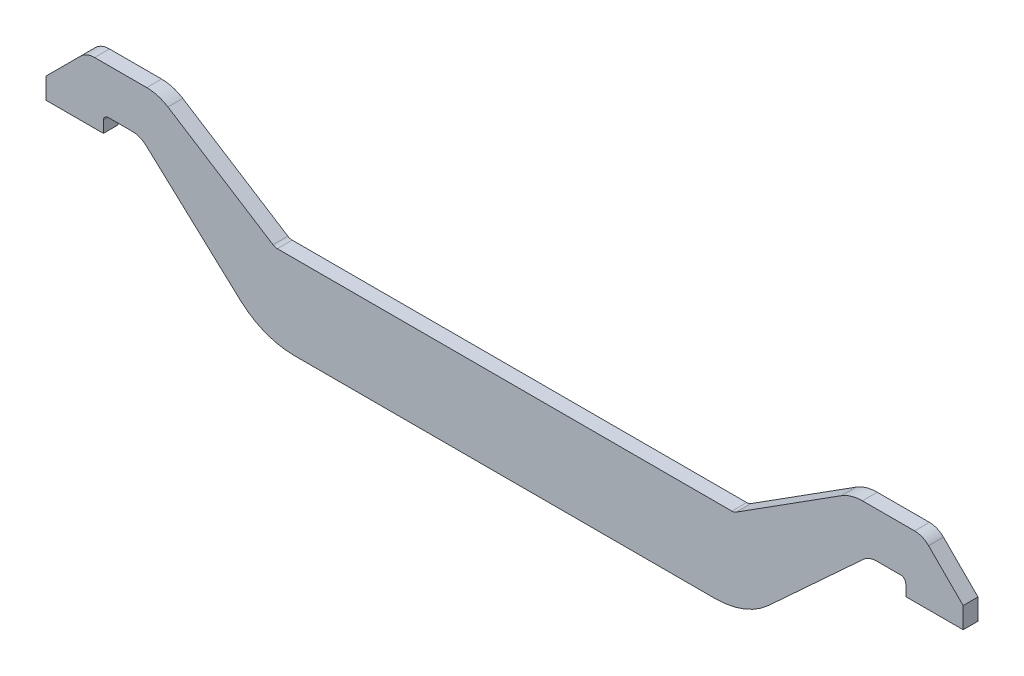
ISO-10303-21;
HEADER;
FILE_DESCRIPTION(('STEP AP214'),'2;1');
FILE_NAME('part.step','',(''),(''),'','','');
FILE_SCHEMA(('AUTOMOTIVE_DESIGN { 1 0 10303 214 1 1 1 1 }'));
ENDSEC;
DATA;
#1=APPLICATION_CONTEXT('core data for automotive mechanical design processes');
#2=APPLICATION_PROTOCOL_DEFINITION('international standard','automotive_design',2000,#1);
#3=PRODUCT_CONTEXT('',#1,'mechanical');
#4=PRODUCT('Part','Part','',(#3));
#5=PRODUCT_RELATED_PRODUCT_CATEGORY('part','',(#4));
#6=PRODUCT_DEFINITION_FORMATION('','',#4);
#7=PRODUCT_DEFINITION_CONTEXT('part definition',#1,'design');
#8=PRODUCT_DEFINITION('design','',#6,#7);
#9=PRODUCT_DEFINITION_SHAPE('','',#8);
#10=(LENGTH_UNIT() NAMED_UNIT(*) SI_UNIT(.MILLI.,.METRE.));
#11=(NAMED_UNIT(*) PLANE_ANGLE_UNIT() SI_UNIT($,.RADIAN.));
#12=(NAMED_UNIT(*) SI_UNIT($,.STERADIAN.) SOLID_ANGLE_UNIT());
#13=UNCERTAINTY_MEASURE_WITH_UNIT(LENGTH_MEASURE(1.E-05),#10,'distance_accuracy_value','');
#14=(GEOMETRIC_REPRESENTATION_CONTEXT(3) GLOBAL_UNCERTAINTY_ASSIGNED_CONTEXT((#13)) GLOBAL_UNIT_ASSIGNED_CONTEXT((#10,
#11,#12)) REPRESENTATION_CONTEXT('',''));
#15=CARTESIAN_POINT('',(0.,0.,0.));
#16=DIRECTION('',(0.,0.,1.));
#17=DIRECTION('',(1.,0.,0.));
#18=AXIS2_PLACEMENT_3D('',#15,#16,#17);
#19=CARTESIAN_POINT('',(31.2684472351527,-49.1956903166402,4.7625));
#20=DIRECTION('',(-0.536412624057495,0.84395586185046,0.));
#21=DIRECTION('',(-0.84395586185046,-0.536412624057495,0.));
#22=AXIS2_PLACEMENT_3D('',#19,#20,#21);
#23=PLANE('',#22);
#24=DIRECTION('',(0.84395586185046,0.536412624057495,0.));
#25=VECTOR('',#24,1.);
#26=CARTESIAN_POINT('',(31.2684472351527,-49.1956903166402,4.7625));
#27=LINE('',#26,#25);
#28=CARTESIAN_POINT('',(151.753593987816,27.3838521108998,4.7625));
#29=VERTEX_POINT('',#28);
#30=CARTESIAN_POINT('',(185.477030060921,48.8182394455008,4.7625));
#31=VERTEX_POINT('',#30);
#32=EDGE_CURVE('E343',#29,#31,#27,.T.);
#33=ORIENTED_EDGE('',*,*,#32,.T.);
#34=DIRECTION('',(0.,0.,-1.));
#35=VECTOR('',#34,1.);
#36=CARTESIAN_POINT('',(185.477030060921,48.8182394455008,0.));
#37=LINE('',#36,#35);
#38=CARTESIAN_POINT('',(185.477030060921,48.8182394455008,0.));
#39=VERTEX_POINT('',#38);
#40=EDGE_CURVE('E425',#31,#39,#37,.T.);
#41=ORIENTED_EDGE('',*,*,#40,.T.);
#42=DIRECTION('',(0.84395586185046,0.536412624057495,0.));
#43=VECTOR('',#42,1.);
#44=CARTESIAN_POINT('',(31.2684472351527,-49.1956903166402,0.));
#45=LINE('',#44,#43);
#46=CARTESIAN_POINT('',(151.753593987816,27.3838521108998,0.));
#47=VERTEX_POINT('',#46);
#48=EDGE_CURVE('E296',#47,#39,#45,.T.);
#49=ORIENTED_EDGE('',*,*,#48,.F.);
#50=DIRECTION('',(0.,0.,-1.));
#51=VECTOR('',#50,1.);
#52=CARTESIAN_POINT('',(151.753593987816,27.3838521108998,4.7625));
#53=LINE('',#52,#51);
#54=EDGE_CURVE('E375',#47,#29,#53,.F.);
#55=ORIENTED_EDGE('',*,*,#54,.T.);
#56=EDGE_LOOP('',(#33,#41,#49,#55));
#57=FACE_BOUND('',#56,.T.);
#58=ADVANCED_FACE('F34',(#57),#23,.T.);
#59=CARTESIAN_POINT('',(0.,26.9875,4.7625));
#60=DIRECTION('',(0.,1.,0.));
#61=DIRECTION('',(0.,0.,1.));
#62=AXIS2_PLACEMENT_3D('',#59,#60,#61);
#63=PLANE('',#62);
#64=DIRECTION('',(1.,0.,0.));
#65=VECTOR('',#64,1.);
#66=CARTESIAN_POINT('',(0.,26.9875,4.7625));
#67=LINE('',#66,#65);
#68=CARTESIAN_POINT('',(4.5488940772903,26.9875,4.7625));
#69=VERTEX_POINT('',#68);
#70=CARTESIAN_POINT('',(150.39110592271,26.9875,4.7625));
#71=VERTEX_POINT('',#70);
#72=EDGE_CURVE('E818',#69,#71,#67,.T.);
#73=ORIENTED_EDGE('',*,*,#72,.T.);
#74=DIRECTION('',(0.,0.,-1.));
#75=VECTOR('',#74,1.);
#76=CARTESIAN_POINT('',(150.39110592271,26.9875,0.));
#77=LINE('',#76,#75);
#78=CARTESIAN_POINT('',(150.39110592271,26.9875,0.));
#79=VERTEX_POINT('',#78);
#80=EDGE_CURVE('E372',#71,#79,#77,.T.);
#81=ORIENTED_EDGE('',*,*,#80,.T.);
#82=DIRECTION('',(1.,0.,0.));
#83=VECTOR('',#82,1.);
#84=CARTESIAN_POINT('',(0.,26.9875,0.));
#85=LINE('',#84,#83);
#86=CARTESIAN_POINT('',(4.5488940772903,26.9875,0.));
#87=VERTEX_POINT('',#86);
#88=EDGE_CURVE('E299',#87,#79,#85,.T.);
#89=ORIENTED_EDGE('',*,*,#88,.F.);
#90=DIRECTION('',(0.,0.,-1.));
#91=VECTOR('',#90,1.);
#92=CARTESIAN_POINT('',(4.5488940772903,26.9875,4.7625));
#93=LINE('',#92,#91);
#94=EDGE_CURVE('E370',#87,#69,#93,.F.);
#95=ORIENTED_EDGE('',*,*,#94,.T.);
#96=EDGE_LOOP('',(#73,#81,#89,#95));
#97=FACE_BOUND('',#96,.T.);
#98=ADVANCED_FACE('F523',(#97),#63,.T.);
#99=CARTESIAN_POINT('',(13.3137564581308,20.9469768274592,4.7625));
#100=DIRECTION('',(-0.536412624057495,-0.84395586185046,0.));
#101=DIRECTION('',(0.84395586185046,-0.536412624057495,0.));
#102=AXIS2_PLACEMENT_3D('',#99,#100,#101);
#103=PLANE('',#102);
#104=DIRECTION('',(-0.84395586185046,0.536412624057495,0.));
#105=VECTOR('',#104,1.);
#106=CARTESIAN_POINT('',(13.3137564581308,20.9469768274592,0.));
#107=LINE('',#106,#105);
#108=CARTESIAN_POINT('',(3.18640601218426,27.3838521108998,0.));
#109=VERTEX_POINT('',#108);
#110=CARTESIAN_POINT('',(-30.5370300609213,48.8182394455008,0.));
#111=VERTEX_POINT('',#110);
#112=EDGE_CURVE('E302',#109,#111,#107,.T.);
#113=ORIENTED_EDGE('',*,*,#112,.T.);
#114=DIRECTION('',(0.,0.,-1.));
#115=VECTOR('',#114,1.);
#116=CARTESIAN_POINT('',(-30.5370300609213,48.8182394455008,4.7625));
#117=LINE('',#116,#115);
#118=CARTESIAN_POINT('',(-30.5370300609213,48.8182394455008,4.7625));
#119=VERTEX_POINT('',#118);
#120=EDGE_CURVE('E441',#111,#119,#117,.F.);
#121=ORIENTED_EDGE('',*,*,#120,.T.);
#122=DIRECTION('',(-0.84395586185046,0.536412624057495,0.));
#123=VECTOR('',#122,1.);
#124=CARTESIAN_POINT('',(13.3137564581308,20.9469768274592,4.7625));
#125=LINE('',#124,#123);
#126=CARTESIAN_POINT('',(3.18640601218426,27.3838521108998,4.7625));
#127=VERTEX_POINT('',#126);
#128=EDGE_CURVE('E261',#127,#119,#125,.T.);
#129=ORIENTED_EDGE('',*,*,#128,.F.);
#130=DIRECTION('',(0.,0.,-1.));
#131=VECTOR('',#130,1.);
#132=CARTESIAN_POINT('',(3.18640601218426,27.3838521108998,4.7625));
#133=LINE('',#132,#131);
#134=EDGE_CURVE('E377',#127,#109,#133,.T.);
#135=ORIENTED_EDGE('',*,*,#134,.T.);
#136=EDGE_LOOP('',(#113,#121,#129,#135));
#137=FACE_BOUND('',#136,.T.);
#138=ADVANCED_FACE('F529',(#137),#103,.F.);
#139=CARTESIAN_POINT('',(0.,50.8,4.7625));
#140=DIRECTION('',(0.,1.,0.));
#141=DIRECTION('',(0.,0.,1.));
#142=AXIS2_PLACEMENT_3D('',#139,#140,#141);
#143=PLANE('',#142);
#144=DIRECTION('',(1.,0.,0.));
#145=VECTOR('',#144,1.);
#146=CARTESIAN_POINT('',(0.,50.8,4.7625));
#147=LINE('',#146,#145);
#148=CARTESIAN_POINT('',(-54.0752438789308,50.8,4.7625));
#149=VERTEX_POINT('',#148);
#150=CARTESIAN_POINT('',(-37.3494703864515,50.8,4.7625));
#151=VERTEX_POINT('',#150);
#152=EDGE_CURVE('E258',#149,#151,#147,.T.);
#153=ORIENTED_EDGE('',*,*,#152,.T.);
#154=DIRECTION('',(0.,0.,-1.));
#155=VECTOR('',#154,1.);
#156=CARTESIAN_POINT('',(-37.3494703864515,50.8,0.));
#157=LINE('',#156,#155);
#158=CARTESIAN_POINT('',(-37.3494703864515,50.8,0.));
#159=VERTEX_POINT('',#158);
#160=EDGE_CURVE('E438',#151,#159,#157,.T.);
#161=ORIENTED_EDGE('',*,*,#160,.T.);
#162=DIRECTION('',(1.,0.,0.));
#163=VECTOR('',#162,1.);
#164=CARTESIAN_POINT('',(0.,50.8,0.));
#165=LINE('',#164,#163);
#166=CARTESIAN_POINT('',(-54.0752438789308,50.8,0.));
#167=VERTEX_POINT('',#166);
#168=EDGE_CURVE('E305',#167,#159,#165,.T.);
#169=ORIENTED_EDGE('',*,*,#168,.F.);
#170=DIRECTION('',(0.,0.,-1.));
#171=VECTOR('',#170,1.);
#172=CARTESIAN_POINT('',(-54.0752438789308,50.8,4.7625));
#173=LINE('',#172,#171);
#174=EDGE_CURVE('E394',#167,#149,#173,.F.);
#175=ORIENTED_EDGE('',*,*,#174,.T.);
#176=EDGE_LOOP('',(#153,#161,#169,#175));
#177=FACE_BOUND('',#176,.T.);
#178=ADVANCED_FACE('F664',(#177),#143,.T.);
#179=CARTESIAN_POINT('',(-53.75275,53.75275,4.7625));
#180=DIRECTION('',(-0.707106781186548,0.707106781186547,0.));
#181=DIRECTION('',(-0.707106781186547,-0.707106781186548,0.));
#182=AXIS2_PLACEMENT_3D('',#179,#180,#181);
#183=PLANE('',#182);
#184=DIRECTION('',(0.707106781186547,0.707106781186548,0.));
#185=VECTOR('',#184,1.);
#186=CARTESIAN_POINT('',(-53.75275,53.75275,4.7625));
#187=LINE('',#186,#185);
#188=CARTESIAN_POINT('',(-69.6595,37.846,4.7625));
#189=VERTEX_POINT('',#188);
#190=CARTESIAN_POINT('',(-58.5653719394654,48.9401280605346,4.7625));
#191=VERTEX_POINT('',#190);
#192=EDGE_CURVE('E236',#189,#191,#187,.T.);
#193=ORIENTED_EDGE('',*,*,#192,.T.);
#194=DIRECTION('',(0.,0.,-1.));
#195=VECTOR('',#194,1.);
#196=CARTESIAN_POINT('',(-58.5653719394654,48.9401280605346,4.7625));
#197=LINE('',#196,#195);
#198=CARTESIAN_POINT('',(-58.5653719394654,48.9401280605346,0.));
#199=VERTEX_POINT('',#198);
#200=EDGE_CURVE('E388',#191,#199,#197,.T.);
#201=ORIENTED_EDGE('',*,*,#200,.T.);
#202=DIRECTION('',(0.707106781186547,0.707106781186548,0.));
#203=VECTOR('',#202,1.);
#204=CARTESIAN_POINT('',(-53.75275,53.75275,0.));
#205=LINE('',#204,#203);
#206=CARTESIAN_POINT('',(-69.6595,37.846,0.));
#207=VERTEX_POINT('',#206);
#208=EDGE_CURVE('E239',#207,#199,#205,.T.);
#209=ORIENTED_EDGE('',*,*,#208,.F.);
#210=DIRECTION('',(0.,0.,-1.));
#211=VECTOR('',#210,1.);
#212=CARTESIAN_POINT('',(-69.6595,37.846,4.7625));
#213=LINE('',#212,#211);
#214=EDGE_CURVE('E231',#189,#207,#213,.T.);
#215=ORIENTED_EDGE('',*,*,#214,.F.);
#216=EDGE_LOOP('',(#193,#201,#209,#215));
#217=FACE_BOUND('',#216,.T.);
#218=ADVANCED_FACE('F233',(#217),#183,.T.);
#219=CARTESIAN_POINT('',(-69.6595,0.,4.7625));
#220=DIRECTION('',(1.,0.,0.));
#221=DIRECTION('',(0.,0.,-1.));
#222=AXIS2_PLACEMENT_3D('',#219,#220,#221);
#223=PLANE('',#222);
#224=DIRECTION('',(0.,-1.,0.));
#225=VECTOR('',#224,1.);
#226=CARTESIAN_POINT('',(-69.6595,0.,0.));
#227=LINE('',#226,#225);
#228=CARTESIAN_POINT('',(-69.6595,31.115,0.));
#229=VERTEX_POINT('',#228);
#230=EDGE_CURVE('E309',#207,#229,#227,.T.);
#231=ORIENTED_EDGE('',*,*,#230,.T.);
#232=DIRECTION('',(0.,0.,-1.));
#233=VECTOR('',#232,1.);
#234=CARTESIAN_POINT('',(-69.6595,31.115,4.7625));
#235=LINE('',#234,#233);
#236=CARTESIAN_POINT('',(-69.6595,31.115,4.7625));
#237=VERTEX_POINT('',#236);
#238=EDGE_CURVE('E243',#237,#229,#235,.T.);
#239=ORIENTED_EDGE('',*,*,#238,.F.);
#240=DIRECTION('',(0.,-1.,0.));
#241=VECTOR('',#240,1.);
#242=CARTESIAN_POINT('',(-69.6595,0.,4.7625));
#243=LINE('',#242,#241);
#244=EDGE_CURVE('E246',#189,#237,#243,.T.);
#245=ORIENTED_EDGE('',*,*,#244,.F.);
#246=ORIENTED_EDGE('',*,*,#214,.T.);
#247=EDGE_LOOP('',(#231,#239,#245,#246));
#248=FACE_BOUND('',#247,.T.);
#249=ADVANCED_FACE('F247',(#248),#223,.F.);
#250=CARTESIAN_POINT('',(0.,31.115,4.7625));
#251=DIRECTION('',(0.,1.,0.));
#252=DIRECTION('',(0.,0.,1.));
#253=AXIS2_PLACEMENT_3D('',#250,#251,#252);
#254=PLANE('',#253);
#255=DIRECTION('',(1.,0.,0.));
#256=VECTOR('',#255,1.);
#257=CARTESIAN_POINT('',(0.,31.115,0.));
#258=LINE('',#257,#256);
#259=CARTESIAN_POINT('',(-51.2445,31.115,0.));
#260=VERTEX_POINT('',#259);
#261=EDGE_CURVE('E311',#229,#260,#258,.T.);
#262=ORIENTED_EDGE('',*,*,#261,.T.);
#263=DIRECTION('',(0.,0.,-1.));
#264=VECTOR('',#263,1.);
#265=CARTESIAN_POINT('',(-51.2445,31.115,4.7625));
#266=LINE('',#265,#264);
#267=CARTESIAN_POINT('',(-51.2445,31.115,4.7625));
#268=VERTEX_POINT('',#267);
#269=EDGE_CURVE('E349',#268,#260,#266,.T.);
#270=ORIENTED_EDGE('',*,*,#269,.F.);
#271=DIRECTION('',(1.,0.,0.));
#272=VECTOR('',#271,1.);
#273=CARTESIAN_POINT('',(0.,31.115,4.7625));
#274=LINE('',#273,#272);
#275=EDGE_CURVE('E251',#237,#268,#274,.T.);
#276=ORIENTED_EDGE('',*,*,#275,.F.);
#277=ORIENTED_EDGE('',*,*,#238,.T.);
#278=EDGE_LOOP('',(#262,#270,#276,#277));
#279=FACE_BOUND('',#278,.T.);
#280=ADVANCED_FACE('F513',(#279),#254,.F.);
#281=CARTESIAN_POINT('',(-51.2445,0.,4.7625));
#282=DIRECTION('',(-1.,0.,0.));
#283=DIRECTION('',(0.,0.,1.));
#284=AXIS2_PLACEMENT_3D('',#281,#282,#283);
#285=PLANE('',#284);
#286=DIRECTION('',(0.,1.,0.));
#287=VECTOR('',#286,1.);
#288=CARTESIAN_POINT('',(-51.2445,0.,0.));
#289=LINE('',#288,#287);
#290=CARTESIAN_POINT('',(-51.2445,34.7345,0.));
#291=VERTEX_POINT('',#290);
#292=EDGE_CURVE('E313',#260,#291,#289,.T.);
#293=ORIENTED_EDGE('',*,*,#292,.T.);
#294=DIRECTION('',(0.,0.,-1.));
#295=VECTOR('',#294,1.);
#296=CARTESIAN_POINT('',(-51.2445,34.7345,4.7625));
#297=LINE('',#296,#295);
#298=CARTESIAN_POINT('',(-51.2445,34.7345,4.7625));
#299=VERTEX_POINT('',#298);
#300=EDGE_CURVE('E49',#291,#299,#297,.F.);
#301=ORIENTED_EDGE('',*,*,#300,.T.);
#302=DIRECTION('',(0.,1.,0.));
#303=VECTOR('',#302,1.);
#304=CARTESIAN_POINT('',(-51.2445,0.,4.7625));
#305=LINE('',#304,#303);
#306=EDGE_CURVE('E266',#268,#299,#305,.T.);
#307=ORIENTED_EDGE('',*,*,#306,.F.);
#308=ORIENTED_EDGE('',*,*,#269,.T.);
#309=EDGE_LOOP('',(#293,#301,#307,#308));
#310=FACE_BOUND('',#309,.T.);
#311=ADVANCED_FACE('F510',(#310),#285,.F.);
#312=CARTESIAN_POINT('',(0.,36.322,4.7625));
#313=DIRECTION('',(0.,1.,0.));
#314=DIRECTION('',(0.,0.,1.));
#315=AXIS2_PLACEMENT_3D('',#312,#313,#314);
#316=PLANE('',#315);
#317=DIRECTION('',(1.,0.,0.));
#318=VECTOR('',#317,1.);
#319=CARTESIAN_POINT('',(0.,36.322,4.7625));
#320=LINE('',#319,#318);
#321=CARTESIAN_POINT('',(-49.657,36.322,4.7625));
#322=VERTEX_POINT('',#321);
#323=CARTESIAN_POINT('',(-41.912327322111,36.322,4.7625));
#324=VERTEX_POINT('',#323);
#325=EDGE_CURVE('E268',#322,#324,#320,.T.);
#326=ORIENTED_EDGE('',*,*,#325,.F.);
#327=DIRECTION('',(0.,0.,-1.));
#328=VECTOR('',#327,1.);
#329=CARTESIAN_POINT('',(-49.657,36.322,0.));
#330=LINE('',#329,#328);
#331=CARTESIAN_POINT('',(-49.657,36.322,0.));
#332=VERTEX_POINT('',#331);
#333=EDGE_CURVE('E448',#322,#332,#330,.T.);
#334=ORIENTED_EDGE('',*,*,#333,.T.);
#335=DIRECTION('',(1.,0.,0.));
#336=VECTOR('',#335,1.);
#337=CARTESIAN_POINT('',(0.,36.322,0.));
#338=LINE('',#337,#336);
#339=CARTESIAN_POINT('',(-41.912327322111,36.322,0.));
#340=VERTEX_POINT('',#339);
#341=EDGE_CURVE('E315',#332,#340,#338,.T.);
#342=ORIENTED_EDGE('',*,*,#341,.T.);
#343=DIRECTION('',(0.,0.,-1.));
#344=VECTOR('',#343,1.);
#345=CARTESIAN_POINT('',(-41.912327322111,36.322,4.7625));
#346=LINE('',#345,#344);
#347=EDGE_CURVE('E412',#340,#324,#346,.F.);
#348=ORIENTED_EDGE('',*,*,#347,.T.);
#349=EDGE_LOOP('',(#326,#334,#342,#348));
#350=FACE_BOUND('',#349,.T.);
#351=ADVANCED_FACE('F505',(#350),#316,.F.);
#352=CARTESIAN_POINT('',(0.,0.,4.7625));
#353=DIRECTION('',(-0.677492617912388,-0.735529572943344,0.));
#354=DIRECTION('',(0.735529572943345,-0.677492617912388,0.));
#355=AXIS2_PLACEMENT_3D('',#352,#353,#354);
#356=PLANE('',#355);
#357=DIRECTION('',(-0.735529572943344,0.677492617912388,0.));
#358=VECTOR('',#357,1.);
#359=CARTESIAN_POINT('',(0.,0.,4.7625));
#360=LINE('',#359,#358);
#361=CARTESIAN_POINT('',(-7.2930032065305,6.71754884723905,4.7625));
#362=VERTEX_POINT('',#361);
#363=CARTESIAN_POINT('',(-37.6102491983674,34.6426127881902,4.7625));
#364=VERTEX_POINT('',#363);
#365=EDGE_CURVE('E270',#362,#364,#360,.T.);
#366=ORIENTED_EDGE('',*,*,#365,.T.);
#367=DIRECTION('',(0.,0.,-1.));
#368=VECTOR('',#367,1.);
#369=CARTESIAN_POINT('',(-37.6102491983674,34.6426127881902,4.7625));
#370=LINE('',#369,#368);
#371=CARTESIAN_POINT('',(-37.6102491983674,34.6426127881902,0.));
#372=VERTEX_POINT('',#371);
#373=EDGE_CURVE('E409',#364,#372,#370,.T.);
#374=ORIENTED_EDGE('',*,*,#373,.T.);
#375=DIRECTION('',(-0.735529572943344,0.677492617912388,0.));
#376=VECTOR('',#375,1.);
#377=CARTESIAN_POINT('',(0.,0.,0.));
#378=LINE('',#377,#376);
#379=CARTESIAN_POINT('',(-7.2930032065305,6.71754884723905,0.));
#380=VERTEX_POINT('',#379);
#381=EDGE_CURVE('E317',#380,#372,#378,.T.);
#382=ORIENTED_EDGE('',*,*,#381,.F.);
#383=DIRECTION('',(0.,0.,-1.));
#384=VECTOR('',#383,1.);
#385=CARTESIAN_POINT('',(-7.2930032065305,6.71754884723905,4.7625));
#386=LINE('',#385,#384);
#387=EDGE_CURVE('E368',#380,#362,#386,.F.);
#388=ORIENTED_EDGE('',*,*,#387,.T.);
#389=EDGE_LOOP('',(#366,#374,#382,#388));
#390=FACE_BOUND('',#389,.T.);
#391=ADVANCED_FACE('F496',(#390),#356,.T.);
#392=CARTESIAN_POINT('',(0.,0.,4.7625));
#393=DIRECTION('',(0.,1.,0.));
#394=DIRECTION('',(0.,0.,1.));
#395=AXIS2_PLACEMENT_3D('',#392,#393,#394);
#396=PLANE('',#395);
#397=DIRECTION('',(1.,0.,0.));
#398=VECTOR('',#397,1.);
#399=CARTESIAN_POINT('',(0.,0.,0.));
#400=LINE('',#399,#398);
#401=CARTESIAN_POINT('',(9.91530928844416,0.,0.));
#402=VERTEX_POINT('',#401);
#403=CARTESIAN_POINT('',(145.024690711556,0.,0.));
#404=VERTEX_POINT('',#403);
#405=EDGE_CURVE('E320',#402,#404,#400,.T.);
#406=ORIENTED_EDGE('',*,*,#405,.T.);
#407=DIRECTION('',(0.,0.,-1.));
#408=VECTOR('',#407,1.);
#409=CARTESIAN_POINT('',(145.024690711556,0.,4.7625));
#410=LINE('',#409,#408);
#411=CARTESIAN_POINT('',(145.024690711556,0.,4.7625));
#412=VERTEX_POINT('',#411);
#413=EDGE_CURVE('E362',#404,#412,#410,.F.);
#414=ORIENTED_EDGE('',*,*,#413,.T.);
#415=DIRECTION('',(1.,0.,0.));
#416=VECTOR('',#415,1.);
#417=CARTESIAN_POINT('',(0.,0.,4.7625));
#418=LINE('',#417,#416);
#419=CARTESIAN_POINT('',(9.91530928844416,0.,4.7625));
#420=VERTEX_POINT('',#419);
#421=EDGE_CURVE('E273',#420,#412,#418,.T.);
#422=ORIENTED_EDGE('',*,*,#421,.F.);
#423=DIRECTION('',(0.,0.,-1.));
#424=VECTOR('',#423,1.);
#425=CARTESIAN_POINT('',(9.91530928844416,0.,0.));
#426=LINE('',#425,#424);
#427=EDGE_CURVE('E359',#420,#402,#426,.T.);
#428=ORIENTED_EDGE('',*,*,#427,.T.);
#429=EDGE_LOOP('',(#406,#414,#422,#428));
#430=FACE_BOUND('',#429,.T.);
#431=ADVANCED_FACE('F487',(#430),#396,.F.);
#432=CARTESIAN_POINT('',(71.1168785606566,-77.2090587170764,4.7625));
#433=DIRECTION('',(-0.677492617912388,0.735529572943344,0.));
#434=DIRECTION('',(-0.735529572943345,-0.677492617912388,0.));
#435=AXIS2_PLACEMENT_3D('',#432,#433,#434);
#436=PLANE('',#435);
#437=DIRECTION('',(0.735529572943344,0.677492617912388,0.));
#438=VECTOR('',#437,1.);
#439=CARTESIAN_POINT('',(71.1168785606566,-77.2090587170764,0.));
#440=LINE('',#439,#438);
#441=CARTESIAN_POINT('',(162.23300320653,6.71754884723905,0.));
#442=VERTEX_POINT('',#441);
#443=CARTESIAN_POINT('',(192.550249198367,34.6426127881902,0.));
#444=VERTEX_POINT('',#443);
#445=EDGE_CURVE('E323',#442,#444,#440,.T.);
#446=ORIENTED_EDGE('',*,*,#445,.T.);
#447=DIRECTION('',(0.,0.,-1.));
#448=VECTOR('',#447,1.);
#449=CARTESIAN_POINT('',(192.550249198367,34.6426127881902,4.7625));
#450=LINE('',#449,#448);
#451=CARTESIAN_POINT('',(192.550249198367,34.6426127881902,4.7625));
#452=VERTEX_POINT('',#451);
#453=EDGE_CURVE('E407',#444,#452,#450,.F.);
#454=ORIENTED_EDGE('',*,*,#453,.T.);
#455=DIRECTION('',(0.735529572943344,0.677492617912388,0.));
#456=VECTOR('',#455,1.);
#457=CARTESIAN_POINT('',(71.1168785606566,-77.2090587170764,4.7625));
#458=LINE('',#457,#456);
#459=CARTESIAN_POINT('',(162.23300320653,6.71754884723905,4.7625));
#460=VERTEX_POINT('',#459);
#461=EDGE_CURVE('E276',#460,#452,#458,.T.);
#462=ORIENTED_EDGE('',*,*,#461,.F.);
#463=DIRECTION('',(0.,0.,-1.));
#464=VECTOR('',#463,1.);
#465=CARTESIAN_POINT('',(162.23300320653,6.71754884723905,4.7625));
#466=LINE('',#465,#464);
#467=EDGE_CURVE('E242',#460,#442,#466,.T.);
#468=ORIENTED_EDGE('',*,*,#467,.T.);
#469=EDGE_LOOP('',(#446,#454,#462,#468));
#470=FACE_BOUND('',#469,.T.);
#471=ADVANCED_FACE('F478',(#470),#436,.F.);
#472=CARTESIAN_POINT('',(0.,36.322,4.7625));
#473=DIRECTION('',(0.,-1.,0.));
#474=DIRECTION('',(0.,0.,-1.));
#475=AXIS2_PLACEMENT_3D('',#472,#473,#474);
#476=PLANE('',#475);
#477=DIRECTION('',(-1.,0.,0.));
#478=VECTOR('',#477,1.);
#479=CARTESIAN_POINT('',(0.,36.322,0.));
#480=LINE('',#479,#478);
#481=CARTESIAN_POINT('',(204.597,36.322,0.));
#482=VERTEX_POINT('',#481);
#483=CARTESIAN_POINT('',(196.852327322111,36.322,0.));
#484=VERTEX_POINT('',#483);
#485=EDGE_CURVE('E326',#482,#484,#480,.T.);
#486=ORIENTED_EDGE('',*,*,#485,.F.);
#487=DIRECTION('',(0.,0.,-1.));
#488=VECTOR('',#487,1.);
#489=CARTESIAN_POINT('',(204.597,36.322,4.7625));
#490=LINE('',#489,#488);
#491=CARTESIAN_POINT('',(204.597,36.322,4.7625));
#492=VERTEX_POINT('',#491);
#493=EDGE_CURVE('E446',#482,#492,#490,.F.);
#494=ORIENTED_EDGE('',*,*,#493,.T.);
#495=DIRECTION('',(-1.,0.,0.));
#496=VECTOR('',#495,1.);
#497=CARTESIAN_POINT('',(0.,36.322,4.7625));
#498=LINE('',#497,#496);
#499=CARTESIAN_POINT('',(196.852327322111,36.322,4.7625));
#500=VERTEX_POINT('',#499);
#501=EDGE_CURVE('E279',#492,#500,#498,.T.);
#502=ORIENTED_EDGE('',*,*,#501,.T.);
#503=DIRECTION('',(0.,0.,-1.));
#504=VECTOR('',#503,1.);
#505=CARTESIAN_POINT('',(196.852327322111,36.322,4.7625));
#506=LINE('',#505,#504);
#507=EDGE_CURVE('E404',#500,#484,#506,.T.);
#508=ORIENTED_EDGE('',*,*,#507,.T.);
#509=EDGE_LOOP('',(#486,#494,#502,#508));
#510=FACE_BOUND('',#509,.T.);
#511=ADVANCED_FACE('F470',(#510),#476,.T.);
#512=CARTESIAN_POINT('',(206.1845,0.,4.7625));
#513=DIRECTION('',(-1.,0.,0.));
#514=DIRECTION('',(0.,0.,1.));
#515=AXIS2_PLACEMENT_3D('',#512,#513,#514);
#516=PLANE('',#515);
#517=DIRECTION('',(0.,1.,0.));
#518=VECTOR('',#517,1.);
#519=CARTESIAN_POINT('',(206.1845,0.,4.7625));
#520=LINE('',#519,#518);
#521=CARTESIAN_POINT('',(206.1845,31.115,4.7625));
#522=VERTEX_POINT('',#521);
#523=CARTESIAN_POINT('',(206.1845,34.7345,4.7625));
#524=VERTEX_POINT('',#523);
#525=EDGE_CURVE('E281',#522,#524,#520,.T.);
#526=ORIENTED_EDGE('',*,*,#525,.T.);
#527=DIRECTION('',(0.,0.,-1.));
#528=VECTOR('',#527,1.);
#529=CARTESIAN_POINT('',(206.1845,34.7345,0.));
#530=LINE('',#529,#528);
#531=CARTESIAN_POINT('',(206.1845,34.7345,0.));
#532=VERTEX_POINT('',#531);
#533=EDGE_CURVE('E443',#524,#532,#530,.T.);
#534=ORIENTED_EDGE('',*,*,#533,.T.);
#535=DIRECTION('',(0.,1.,0.));
#536=VECTOR('',#535,1.);
#537=CARTESIAN_POINT('',(206.1845,0.,0.));
#538=LINE('',#537,#536);
#539=CARTESIAN_POINT('',(206.1845,31.115,0.));
#540=VERTEX_POINT('',#539);
#541=EDGE_CURVE('E328',#540,#532,#538,.T.);
#542=ORIENTED_EDGE('',*,*,#541,.F.);
#543=DIRECTION('',(0.,0.,-1.));
#544=VECTOR('',#543,1.);
#545=CARTESIAN_POINT('',(206.1845,31.115,4.7625));
#546=LINE('',#545,#544);
#547=EDGE_CURVE('E347',#522,#540,#546,.T.);
#548=ORIENTED_EDGE('',*,*,#547,.F.);
#549=EDGE_LOOP('',(#526,#534,#542,#548));
#550=FACE_BOUND('',#549,.T.);
#551=ADVANCED_FACE('F463',(#550),#516,.T.);
#552=CARTESIAN_POINT('',(0.,31.115,4.7625));
#553=DIRECTION('',(0.,-1.,0.));
#554=DIRECTION('',(0.,0.,-1.));
#555=AXIS2_PLACEMENT_3D('',#552,#553,#554);
#556=PLANE('',#555);
#557=DIRECTION('',(-1.,0.,0.));
#558=VECTOR('',#557,1.);
#559=CARTESIAN_POINT('',(0.,31.115,0.));
#560=LINE('',#559,#558);
#561=CARTESIAN_POINT('',(224.5995,31.115,0.));
#562=VERTEX_POINT('',#561);
#563=EDGE_CURVE('E331',#562,#540,#560,.T.);
#564=ORIENTED_EDGE('',*,*,#563,.F.);
#565=DIRECTION('',(0.,0.,-1.));
#566=VECTOR('',#565,1.);
#567=CARTESIAN_POINT('',(224.5995,31.115,4.7625));
#568=LINE('',#567,#566);
#569=CARTESIAN_POINT('',(224.5995,31.115,4.7625));
#570=VERTEX_POINT('',#569);
#571=EDGE_CURVE('E345',#570,#562,#568,.T.);
#572=ORIENTED_EDGE('',*,*,#571,.F.);
#573=DIRECTION('',(-1.,0.,0.));
#574=VECTOR('',#573,1.);
#575=CARTESIAN_POINT('',(0.,31.115,4.7625));
#576=LINE('',#575,#574);
#577=EDGE_CURVE('E284',#570,#522,#576,.T.);
#578=ORIENTED_EDGE('',*,*,#577,.T.);
#579=ORIENTED_EDGE('',*,*,#547,.T.);
#580=EDGE_LOOP('',(#564,#572,#578,#579));
#581=FACE_BOUND('',#580,.T.);
#582=ADVANCED_FACE('F607',(#581),#556,.T.);
#583=CARTESIAN_POINT('',(224.5995,0.,4.7625));
#584=DIRECTION('',(1.,0.,0.));
#585=DIRECTION('',(0.,0.,-1.));
#586=AXIS2_PLACEMENT_3D('',#583,#584,#585);
#587=PLANE('',#586);
#588=DIRECTION('',(0.,-1.,0.));
#589=VECTOR('',#588,1.);
#590=CARTESIAN_POINT('',(224.5995,0.,0.));
#591=LINE('',#590,#589);
#592=CARTESIAN_POINT('',(224.5995,37.846,0.));
#593=VERTEX_POINT('',#592);
#594=EDGE_CURVE('E334',#593,#562,#591,.T.);
#595=ORIENTED_EDGE('',*,*,#594,.F.);
#596=DIRECTION('',(0.,0.,-1.));
#597=VECTOR('',#596,1.);
#598=CARTESIAN_POINT('',(224.5995,37.846,4.7625));
#599=LINE('',#598,#597);
#600=CARTESIAN_POINT('',(224.5995,37.846,4.7625));
#601=VERTEX_POINT('',#600);
#602=EDGE_CURVE('E295',#601,#593,#599,.T.);
#603=ORIENTED_EDGE('',*,*,#602,.F.);
#604=DIRECTION('',(0.,-1.,0.));
#605=VECTOR('',#604,1.);
#606=CARTESIAN_POINT('',(224.5995,0.,4.7625));
#607=LINE('',#606,#605);
#608=EDGE_CURVE('E287',#601,#570,#607,.T.);
#609=ORIENTED_EDGE('',*,*,#608,.T.);
#610=ORIENTED_EDGE('',*,*,#571,.T.);
#611=EDGE_LOOP('',(#595,#603,#609,#610));
#612=FACE_BOUND('',#611,.T.);
#613=ADVANCED_FACE('F715',(#612),#587,.T.);
#614=CARTESIAN_POINT('',(131.222750000001,131.22275,4.7625));
#615=DIRECTION('',(-0.707106781186549,-0.707106781186546,0.));
#616=DIRECTION('',(0.707106781186546,-0.707106781186549,0.));
#617=AXIS2_PLACEMENT_3D('',#614,#615,#616);
#618=PLANE('',#617);
#619=DIRECTION('',(-0.707106781186546,0.707106781186549,0.));
#620=VECTOR('',#619,1.);
#621=CARTESIAN_POINT('',(131.222750000001,131.22275,0.));
#622=LINE('',#621,#620);
#623=CARTESIAN_POINT('',(213.505371939465,48.9401280605345,0.));
#624=VERTEX_POINT('',#623);
#625=EDGE_CURVE('E337',#593,#624,#622,.T.);
#626=ORIENTED_EDGE('',*,*,#625,.T.);
#627=DIRECTION('',(0.,0.,-1.));
#628=VECTOR('',#627,1.);
#629=CARTESIAN_POINT('',(213.505371939465,48.9401280605345,4.7625));
#630=LINE('',#629,#628);
#631=CARTESIAN_POINT('',(213.505371939465,48.9401280605345,4.7625));
#632=VERTEX_POINT('',#631);
#633=EDGE_CURVE('E402',#624,#632,#630,.F.);
#634=ORIENTED_EDGE('',*,*,#633,.T.);
#635=DIRECTION('',(-0.707106781186546,0.707106781186549,0.));
#636=VECTOR('',#635,1.);
#637=CARTESIAN_POINT('',(131.222750000001,131.22275,4.7625));
#638=LINE('',#637,#636);
#639=EDGE_CURVE('E290',#601,#632,#638,.T.);
#640=ORIENTED_EDGE('',*,*,#639,.F.);
#641=ORIENTED_EDGE('',*,*,#602,.T.);
#642=EDGE_LOOP('',(#626,#634,#640,#641));
#643=FACE_BOUND('',#642,.T.);
#644=ADVANCED_FACE('F656',(#643),#618,.F.);
#645=CARTESIAN_POINT('',(0.,50.8,4.7625));
#646=DIRECTION('',(0.,-1.,0.));
#647=DIRECTION('',(0.,0.,-1.));
#648=AXIS2_PLACEMENT_3D('',#645,#646,#647);
#649=PLANE('',#648);
#650=DIRECTION('',(-1.,0.,0.));
#651=VECTOR('',#650,1.);
#652=CARTESIAN_POINT('',(0.,50.8,0.));
#653=LINE('',#652,#651);
#654=CARTESIAN_POINT('',(209.015243878931,50.8,0.));
#655=VERTEX_POINT('',#654);
#656=CARTESIAN_POINT('',(192.289470386452,50.8,0.));
#657=VERTEX_POINT('',#656);
#658=EDGE_CURVE('E340',#655,#657,#653,.T.);
#659=ORIENTED_EDGE('',*,*,#658,.T.);
#660=DIRECTION('',(0.,0.,-1.));
#661=VECTOR('',#660,1.);
#662=CARTESIAN_POINT('',(192.289470386452,50.8,4.7625));
#663=LINE('',#662,#661);
#664=CARTESIAN_POINT('',(192.289470386452,50.8,4.7625));
#665=VERTEX_POINT('',#664);
#666=EDGE_CURVE('E432',#657,#665,#663,.F.);
#667=ORIENTED_EDGE('',*,*,#666,.T.);
#668=DIRECTION('',(-1.,0.,0.));
#669=VECTOR('',#668,1.);
#670=CARTESIAN_POINT('',(0.,50.8,4.7625));
#671=LINE('',#670,#669);
#672=CARTESIAN_POINT('',(209.015243878931,50.8,4.7625));
#673=VERTEX_POINT('',#672);
#674=EDGE_CURVE('E293',#673,#665,#671,.T.);
#675=ORIENTED_EDGE('',*,*,#674,.F.);
#676=DIRECTION('',(0.,0.,-1.));
#677=VECTOR('',#676,1.);
#678=CARTESIAN_POINT('',(209.015243878931,50.8,4.7625));
#679=LINE('',#678,#677);
#680=EDGE_CURVE('E399',#673,#655,#679,.T.);
#681=ORIENTED_EDGE('',*,*,#680,.T.);
#682=EDGE_LOOP('',(#659,#667,#675,#681));
#683=FACE_BOUND('',#682,.T.);
#684=ADVANCED_FACE('F596',(#683),#649,.F.);
#685=CARTESIAN_POINT('',(0.,0.,4.7625));
#686=DIRECTION('',(0.,0.,1.));
#687=DIRECTION('',(1.,0.,0.));
#688=AXIS2_PLACEMENT_3D('',#685,#686,#687);
#689=PLANE('',#688);
#690=ORIENTED_EDGE('',*,*,#674,.T.);
#691=CARTESIAN_POINT('',(192.289470386452,38.1,4.7625));
#692=DIRECTION('',(0.,0.,1.));
#693=DIRECTION('',(1.,0.,0.));
#694=AXIS2_PLACEMENT_3D('',#691,#692,#693);
#695=CIRCLE('',#694,12.7);
#696=EDGE_CURVE('E436',#665,#31,#695,.T.);
#697=ORIENTED_EDGE('',*,*,#696,.T.);
#698=ORIENTED_EDGE('',*,*,#32,.F.);
#699=CARTESIAN_POINT('',(150.39110592271,29.5275,4.7625));
#700=DIRECTION('',(0.,0.,1.));
#701=DIRECTION('',(1.,0.,0.));
#702=AXIS2_PLACEMENT_3D('',#699,#700,#701);
#703=CIRCLE('',#702,2.54);
#704=EDGE_CURVE('E382',#29,#71,#703,.F.);
#705=ORIENTED_EDGE('',*,*,#704,.T.);
#706=ORIENTED_EDGE('',*,*,#72,.F.);
#707=CARTESIAN_POINT('',(4.5488940772903,29.5275,4.7625));
#708=DIRECTION('',(0.,0.,1.));
#709=DIRECTION('',(1.,0.,0.));
#710=AXIS2_PLACEMENT_3D('',#707,#708,#709);
#711=CIRCLE('',#710,2.54);
#712=EDGE_CURVE('E386',#69,#127,#711,.F.);
#713=ORIENTED_EDGE('',*,*,#712,.T.);
#714=ORIENTED_EDGE('',*,*,#128,.T.);
#715=CARTESIAN_POINT('',(-37.3494703864515,38.1,4.7625));
#716=DIRECTION('',(0.,0.,1.));
#717=DIRECTION('',(1.,0.,0.));
#718=AXIS2_PLACEMENT_3D('',#715,#716,#717);
#719=CIRCLE('',#718,12.7);
#720=EDGE_CURVE('E434',#119,#151,#719,.T.);
#721=ORIENTED_EDGE('',*,*,#720,.T.);
#722=ORIENTED_EDGE('',*,*,#152,.F.);
#723=CARTESIAN_POINT('',(-54.0752438789308,44.45,4.7625));
#724=DIRECTION('',(0.,0.,1.));
#725=DIRECTION('',(1.,0.,0.));
#726=AXIS2_PLACEMENT_3D('',#723,#724,#725);
#727=CIRCLE('',#726,6.35);
#728=EDGE_CURVE('E257',#149,#191,#727,.T.);
#729=ORIENTED_EDGE('',*,*,#728,.T.);
#730=ORIENTED_EDGE('',*,*,#192,.F.);
#731=ORIENTED_EDGE('',*,*,#244,.T.);
#732=ORIENTED_EDGE('',*,*,#275,.T.);
#733=ORIENTED_EDGE('',*,*,#306,.T.);
#734=CARTESIAN_POINT('',(-49.657,34.7345,4.7625));
#735=DIRECTION('',(0.,0.,1.));
#736=DIRECTION('',(1.,0.,0.));
#737=AXIS2_PLACEMENT_3D('',#734,#735,#736);
#738=CIRCLE('',#737,1.5875);
#739=EDGE_CURVE('E11',#299,#322,#738,.F.);
#740=ORIENTED_EDGE('',*,*,#739,.T.);
#741=ORIENTED_EDGE('',*,*,#325,.T.);
#742=CARTESIAN_POINT('',(-41.912327322111,29.972,4.7625));
#743=DIRECTION('',(0.,0.,1.));
#744=DIRECTION('',(1.,0.,0.));
#745=AXIS2_PLACEMENT_3D('',#742,#743,#744);
#746=CIRCLE('',#745,6.35);
#747=EDGE_CURVE('E423',#324,#364,#746,.F.);
#748=ORIENTED_EDGE('',*,*,#747,.T.);
#749=ORIENTED_EDGE('',*,*,#365,.F.);
#750=CARTESIAN_POINT('',(9.91530928844416,25.4,4.7625));
#751=DIRECTION('',(0.,0.,1.));
#752=DIRECTION('',(1.,0.,0.));
#753=AXIS2_PLACEMENT_3D('',#750,#751,#752);
#754=CIRCLE('',#753,25.4);
#755=EDGE_CURVE('E364',#362,#420,#754,.T.);
#756=ORIENTED_EDGE('',*,*,#755,.T.);
#757=ORIENTED_EDGE('',*,*,#421,.T.);
#758=CARTESIAN_POINT('',(145.024690711556,25.4,4.7625));
#759=DIRECTION('',(0.,0.,1.));
#760=DIRECTION('',(1.,0.,0.));
#761=AXIS2_PLACEMENT_3D('',#758,#759,#760);
#762=CIRCLE('',#761,25.4);
#763=EDGE_CURVE('E366',#412,#460,#762,.T.);
#764=ORIENTED_EDGE('',*,*,#763,.T.);
#765=ORIENTED_EDGE('',*,*,#461,.T.);
#766=CARTESIAN_POINT('',(196.852327322111,29.972,4.7625));
#767=DIRECTION('',(0.,0.,1.));
#768=DIRECTION('',(1.,0.,0.));
#769=AXIS2_PLACEMENT_3D('',#766,#767,#768);
#770=CIRCLE('',#769,6.35);
#771=EDGE_CURVE('E417',#452,#500,#770,.F.);
#772=ORIENTED_EDGE('',*,*,#771,.T.);
#773=ORIENTED_EDGE('',*,*,#501,.F.);
#774=CARTESIAN_POINT('',(204.597,34.7345,4.7625));
#775=DIRECTION('',(0.,0.,1.));
#776=DIRECTION('',(1.,0.,0.));
#777=AXIS2_PLACEMENT_3D('',#774,#775,#776);
#778=CIRCLE('',#777,1.5875);
#779=EDGE_CURVE('E454',#492,#524,#778,.F.);
#780=ORIENTED_EDGE('',*,*,#779,.T.);
#781=ORIENTED_EDGE('',*,*,#525,.F.);
#782=ORIENTED_EDGE('',*,*,#577,.F.);
#783=ORIENTED_EDGE('',*,*,#608,.F.);
#784=ORIENTED_EDGE('',*,*,#639,.T.);
#785=CARTESIAN_POINT('',(209.015243878931,44.45,4.7625));
#786=DIRECTION('',(0.,0.,1.));
#787=DIRECTION('',(1.,0.,0.));
#788=AXIS2_PLACEMENT_3D('',#785,#786,#787);
#789=CIRCLE('',#788,6.35);
#790=EDGE_CURVE('E396',#632,#673,#789,.T.);
#791=ORIENTED_EDGE('',*,*,#790,.T.);
#792=EDGE_LOOP('',(#690,#697,#698,#705,#706,#713,#714,#721,#722,#729,#730,#731,#732,#733,#740,
#741,#748,#749,#756,#757,#764,#765,#772,#773,#780,#781,#782,#783,#784,#791));
#793=FACE_BOUND('',#792,.T.);
#794=ADVANCED_FACE('F254',(#793),#689,.T.);
#795=CARTESIAN_POINT('',(0.,0.,0.));
#796=DIRECTION('',(0.,0.,1.));
#797=DIRECTION('',(1.,0.,0.));
#798=AXIS2_PLACEMENT_3D('',#795,#796,#797);
#799=PLANE('',#798);
#800=ORIENTED_EDGE('',*,*,#48,.T.);
#801=CARTESIAN_POINT('',(192.289470386452,38.1,0.));
#802=DIRECTION('',(0.,0.,1.));
#803=DIRECTION('',(1.,0.,0.));
#804=AXIS2_PLACEMENT_3D('',#801,#802,#803);
#805=CIRCLE('',#804,12.7);
#806=EDGE_CURVE('E430',#39,#657,#805,.F.);
#807=ORIENTED_EDGE('',*,*,#806,.T.);
#808=ORIENTED_EDGE('',*,*,#658,.F.);
#809=CARTESIAN_POINT('',(209.015243878931,44.45,0.));
#810=DIRECTION('',(0.,0.,1.));
#811=DIRECTION('',(1.,0.,0.));
#812=AXIS2_PLACEMENT_3D('',#809,#810,#811);
#813=CIRCLE('',#812,6.35);
#814=EDGE_CURVE('E390',#655,#624,#813,.F.);
#815=ORIENTED_EDGE('',*,*,#814,.T.);
#816=ORIENTED_EDGE('',*,*,#625,.F.);
#817=ORIENTED_EDGE('',*,*,#594,.T.);
#818=ORIENTED_EDGE('',*,*,#563,.T.);
#819=ORIENTED_EDGE('',*,*,#541,.T.);
#820=CARTESIAN_POINT('',(204.597,34.7345,0.));
#821=DIRECTION('',(0.,0.,1.));
#822=DIRECTION('',(1.,0.,0.));
#823=AXIS2_PLACEMENT_3D('',#820,#821,#822);
#824=CIRCLE('',#823,1.5875);
#825=EDGE_CURVE('E452',#532,#482,#824,.T.);
#826=ORIENTED_EDGE('',*,*,#825,.T.);
#827=ORIENTED_EDGE('',*,*,#485,.T.);
#828=CARTESIAN_POINT('',(196.852327322111,29.972,0.));
#829=DIRECTION('',(0.,0.,1.));
#830=DIRECTION('',(1.,0.,0.));
#831=AXIS2_PLACEMENT_3D('',#828,#829,#830);
#832=CIRCLE('',#831,6.35);
#833=EDGE_CURVE('E415',#484,#444,#832,.T.);
#834=ORIENTED_EDGE('',*,*,#833,.T.);
#835=ORIENTED_EDGE('',*,*,#445,.F.);
#836=CARTESIAN_POINT('',(145.024690711556,25.4,0.));
#837=DIRECTION('',(0.,0.,1.));
#838=DIRECTION('',(1.,0.,0.));
#839=AXIS2_PLACEMENT_3D('',#836,#837,#838);
#840=CIRCLE('',#839,25.4);
#841=EDGE_CURVE('E357',#442,#404,#840,.F.);
#842=ORIENTED_EDGE('',*,*,#841,.T.);
#843=ORIENTED_EDGE('',*,*,#405,.F.);
#844=CARTESIAN_POINT('',(9.91530928844416,25.4,0.));
#845=DIRECTION('',(0.,0.,1.));
#846=DIRECTION('',(1.,0.,0.));
#847=AXIS2_PLACEMENT_3D('',#844,#845,#846);
#848=CIRCLE('',#847,25.4);
#849=EDGE_CURVE('E355',#402,#380,#848,.F.);
#850=ORIENTED_EDGE('',*,*,#849,.T.);
#851=ORIENTED_EDGE('',*,*,#381,.T.);
#852=CARTESIAN_POINT('',(-41.912327322111,29.972,0.));
#853=DIRECTION('',(0.,0.,1.));
#854=DIRECTION('',(1.,0.,0.));
#855=AXIS2_PLACEMENT_3D('',#852,#853,#854);
#856=CIRCLE('',#855,6.35);
#857=EDGE_CURVE('E420',#372,#340,#856,.T.);
#858=ORIENTED_EDGE('',*,*,#857,.T.);
#859=ORIENTED_EDGE('',*,*,#341,.F.);
#860=CARTESIAN_POINT('',(-49.657,34.7345,0.));
#861=DIRECTION('',(0.,0.,1.));
#862=DIRECTION('',(1.,0.,0.));
#863=AXIS2_PLACEMENT_3D('',#860,#861,#862);
#864=CIRCLE('',#863,1.5875);
#865=EDGE_CURVE('E42',#332,#291,#864,.T.);
#866=ORIENTED_EDGE('',*,*,#865,.T.);
#867=ORIENTED_EDGE('',*,*,#292,.F.);
#868=ORIENTED_EDGE('',*,*,#261,.F.);
#869=ORIENTED_EDGE('',*,*,#230,.F.);
#870=ORIENTED_EDGE('',*,*,#208,.T.);
#871=CARTESIAN_POINT('',(-54.0752438789308,44.45,0.));
#872=DIRECTION('',(0.,0.,1.));
#873=DIRECTION('',(1.,0.,0.));
#874=AXIS2_PLACEMENT_3D('',#871,#872,#873);
#875=CIRCLE('',#874,6.35);
#876=EDGE_CURVE('E392',#199,#167,#875,.F.);
#877=ORIENTED_EDGE('',*,*,#876,.T.);
#878=ORIENTED_EDGE('',*,*,#168,.T.);
#879=CARTESIAN_POINT('',(-37.3494703864515,38.1,0.));
#880=DIRECTION('',(0.,0.,1.));
#881=DIRECTION('',(1.,0.,0.));
#882=AXIS2_PLACEMENT_3D('',#879,#880,#881);
#883=CIRCLE('',#882,12.7);
#884=EDGE_CURVE('E428',#159,#111,#883,.F.);
#885=ORIENTED_EDGE('',*,*,#884,.T.);
#886=ORIENTED_EDGE('',*,*,#112,.F.);
#887=CARTESIAN_POINT('',(4.5488940772903,29.5275,0.));
#888=DIRECTION('',(0.,0.,1.));
#889=DIRECTION('',(1.,0.,0.));
#890=AXIS2_PLACEMENT_3D('',#887,#888,#889);
#891=CIRCLE('',#890,2.54);
#892=EDGE_CURVE('E384',#109,#87,#891,.T.);
#893=ORIENTED_EDGE('',*,*,#892,.T.);
#894=ORIENTED_EDGE('',*,*,#88,.T.);
#895=CARTESIAN_POINT('',(150.39110592271,29.5275,0.));
#896=DIRECTION('',(0.,0.,1.));
#897=DIRECTION('',(1.,0.,0.));
#898=AXIS2_PLACEMENT_3D('',#895,#896,#897);
#899=CIRCLE('',#898,2.54);
#900=EDGE_CURVE('E380',#79,#47,#899,.T.);
#901=ORIENTED_EDGE('',*,*,#900,.T.);
#902=EDGE_LOOP('',(#800,#807,#808,#815,#816,#817,#818,#819,#826,#827,#834,#835,#842,#843,#850,
#851,#858,#859,#866,#867,#868,#869,#870,#877,#878,#885,#886,#893,#894,#901));
#903=FACE_BOUND('',#902,.T.);
#904=ADVANCED_FACE('F467',(#903),#799,.F.);
#905=CARTESIAN_POINT('',(145.024690711556,25.4,4.7625));
#906=DIRECTION('',(0.,0.,-1.));
#907=DIRECTION('',(-1.,0.,0.));
#908=AXIS2_PLACEMENT_3D('',#905,#906,#907);
#909=CYLINDRICAL_SURFACE('',#908,25.4);
#910=ORIENTED_EDGE('',*,*,#763,.F.);
#911=ORIENTED_EDGE('',*,*,#413,.F.);
#912=ORIENTED_EDGE('',*,*,#841,.F.);
#913=ORIENTED_EDGE('',*,*,#467,.F.);
#914=EDGE_LOOP('',(#910,#911,#912,#913));
#915=FACE_BOUND('',#914,.T.);
#916=ADVANCED_FACE('F483',(#915),#909,.T.);
#917=CARTESIAN_POINT('',(9.91530928844416,25.4,4.7625));
#918=DIRECTION('',(0.,0.,1.));
#919=DIRECTION('',(1.,0.,0.));
#920=AXIS2_PLACEMENT_3D('',#917,#918,#919);
#921=CYLINDRICAL_SURFACE('',#920,25.4);
#922=ORIENTED_EDGE('',*,*,#755,.F.);
#923=ORIENTED_EDGE('',*,*,#387,.F.);
#924=ORIENTED_EDGE('',*,*,#849,.F.);
#925=ORIENTED_EDGE('',*,*,#427,.F.);
#926=EDGE_LOOP('',(#922,#923,#924,#925));
#927=FACE_BOUND('',#926,.T.);
#928=ADVANCED_FACE('F492',(#927),#921,.T.);
#929=CARTESIAN_POINT('',(150.39110592271,29.5275,4.7625));
#930=DIRECTION('',(0.,0.,1.));
#931=DIRECTION('',(1.,0.,0.));
#932=AXIS2_PLACEMENT_3D('',#929,#930,#931);
#933=CYLINDRICAL_SURFACE('',#932,2.54);
#934=ORIENTED_EDGE('',*,*,#704,.F.);
#935=ORIENTED_EDGE('',*,*,#54,.F.);
#936=ORIENTED_EDGE('',*,*,#900,.F.);
#937=ORIENTED_EDGE('',*,*,#80,.F.);
#938=EDGE_LOOP('',(#934,#935,#936,#937));
#939=FACE_BOUND('',#938,.T.);
#940=ADVANCED_FACE('F539',(#939),#933,.F.);
#941=CARTESIAN_POINT('',(4.5488940772903,29.5275,4.7625));
#942=DIRECTION('',(0.,0.,-1.));
#943=DIRECTION('',(-1.,0.,0.));
#944=AXIS2_PLACEMENT_3D('',#941,#942,#943);
#945=CYLINDRICAL_SURFACE('',#944,2.54);
#946=ORIENTED_EDGE('',*,*,#712,.F.);
#947=ORIENTED_EDGE('',*,*,#94,.F.);
#948=ORIENTED_EDGE('',*,*,#892,.F.);
#949=ORIENTED_EDGE('',*,*,#134,.F.);
#950=EDGE_LOOP('',(#946,#947,#948,#949));
#951=FACE_BOUND('',#950,.T.);
#952=ADVANCED_FACE('F542',(#951),#945,.F.);
#953=CARTESIAN_POINT('',(-54.0752438789308,44.45,4.7625));
#954=DIRECTION('',(0.,0.,-1.));
#955=DIRECTION('',(-1.,0.,0.));
#956=AXIS2_PLACEMENT_3D('',#953,#954,#955);
#957=CYLINDRICAL_SURFACE('',#956,6.35);
#958=ORIENTED_EDGE('',*,*,#728,.F.);
#959=ORIENTED_EDGE('',*,*,#174,.F.);
#960=ORIENTED_EDGE('',*,*,#876,.F.);
#961=ORIENTED_EDGE('',*,*,#200,.F.);
#962=EDGE_LOOP('',(#958,#959,#960,#961));
#963=FACE_BOUND('',#962,.T.);
#964=ADVANCED_FACE('F546',(#963),#957,.T.);
#965=CARTESIAN_POINT('',(209.015243878931,44.45,4.7625));
#966=DIRECTION('',(0.,0.,-1.));
#967=DIRECTION('',(-1.,0.,0.));
#968=AXIS2_PLACEMENT_3D('',#965,#966,#967);
#969=CYLINDRICAL_SURFACE('',#968,6.35);
#970=ORIENTED_EDGE('',*,*,#790,.F.);
#971=ORIENTED_EDGE('',*,*,#633,.F.);
#972=ORIENTED_EDGE('',*,*,#814,.F.);
#973=ORIENTED_EDGE('',*,*,#680,.F.);
#974=EDGE_LOOP('',(#970,#971,#972,#973));
#975=FACE_BOUND('',#974,.T.);
#976=ADVANCED_FACE('F550',(#975),#969,.T.);
#977=CARTESIAN_POINT('',(196.852327322111,29.972,4.7625));
#978=DIRECTION('',(0.,0.,-1.));
#979=DIRECTION('',(-1.,0.,0.));
#980=AXIS2_PLACEMENT_3D('',#977,#978,#979);
#981=CYLINDRICAL_SURFACE('',#980,6.35);
#982=ORIENTED_EDGE('',*,*,#771,.F.);
#983=ORIENTED_EDGE('',*,*,#453,.F.);
#984=ORIENTED_EDGE('',*,*,#833,.F.);
#985=ORIENTED_EDGE('',*,*,#507,.F.);
#986=EDGE_LOOP('',(#982,#983,#984,#985));
#987=FACE_BOUND('',#986,.T.);
#988=ADVANCED_FACE('F474',(#987),#981,.F.);
#989=CARTESIAN_POINT('',(-41.912327322111,29.972,4.7625));
#990=DIRECTION('',(0.,0.,-1.));
#991=DIRECTION('',(-1.,0.,0.));
#992=AXIS2_PLACEMENT_3D('',#989,#990,#991);
#993=CYLINDRICAL_SURFACE('',#992,6.35);
#994=ORIENTED_EDGE('',*,*,#747,.F.);
#995=ORIENTED_EDGE('',*,*,#347,.F.);
#996=ORIENTED_EDGE('',*,*,#857,.F.);
#997=ORIENTED_EDGE('',*,*,#373,.F.);
#998=EDGE_LOOP('',(#994,#995,#996,#997));
#999=FACE_BOUND('',#998,.T.);
#1000=ADVANCED_FACE('F501',(#999),#993,.F.);
#1001=CARTESIAN_POINT('',(192.289470386452,38.1,4.7625));
#1002=DIRECTION('',(0.,0.,1.));
#1003=DIRECTION('',(1.,0.,0.));
#1004=AXIS2_PLACEMENT_3D('',#1001,#1002,#1003);
#1005=CYLINDRICAL_SURFACE('',#1004,12.7);
#1006=ORIENTED_EDGE('',*,*,#696,.F.);
#1007=ORIENTED_EDGE('',*,*,#666,.F.);
#1008=ORIENTED_EDGE('',*,*,#806,.F.);
#1009=ORIENTED_EDGE('',*,*,#40,.F.);
#1010=EDGE_LOOP('',(#1006,#1007,#1008,#1009));
#1011=FACE_BOUND('',#1010,.T.);
#1012=ADVANCED_FACE('F559',(#1011),#1005,.T.);
#1013=CARTESIAN_POINT('',(-37.3494703864515,38.1,4.7625));
#1014=DIRECTION('',(0.,0.,1.));
#1015=DIRECTION('',(1.,0.,0.));
#1016=AXIS2_PLACEMENT_3D('',#1013,#1014,#1015);
#1017=CYLINDRICAL_SURFACE('',#1016,12.7);
#1018=ORIENTED_EDGE('',*,*,#720,.F.);
#1019=ORIENTED_EDGE('',*,*,#120,.F.);
#1020=ORIENTED_EDGE('',*,*,#884,.F.);
#1021=ORIENTED_EDGE('',*,*,#160,.F.);
#1022=EDGE_LOOP('',(#1018,#1019,#1020,#1021));
#1023=FACE_BOUND('',#1022,.T.);
#1024=ADVANCED_FACE('F562',(#1023),#1017,.T.);
#1025=CARTESIAN_POINT('',(204.597,34.7345,4.7625));
#1026=DIRECTION('',(0.,0.,1.));
#1027=DIRECTION('',(1.,0.,0.));
#1028=AXIS2_PLACEMENT_3D('',#1025,#1026,#1027);
#1029=CYLINDRICAL_SURFACE('',#1028,1.5875);
#1030=ORIENTED_EDGE('',*,*,#779,.F.);
#1031=ORIENTED_EDGE('',*,*,#493,.F.);
#1032=ORIENTED_EDGE('',*,*,#825,.F.);
#1033=ORIENTED_EDGE('',*,*,#533,.F.);
#1034=EDGE_LOOP('',(#1030,#1031,#1032,#1033));
#1035=FACE_BOUND('',#1034,.T.);
#1036=ADVANCED_FACE('F465',(#1035),#1029,.F.);
#1037=CARTESIAN_POINT('',(-49.657,34.7345,4.7625));
#1038=DIRECTION('',(0.,0.,1.));
#1039=DIRECTION('',(1.,0.,0.));
#1040=AXIS2_PLACEMENT_3D('',#1037,#1038,#1039);
#1041=CYLINDRICAL_SURFACE('',#1040,1.5875);
#1042=ORIENTED_EDGE('',*,*,#739,.F.);
#1043=ORIENTED_EDGE('',*,*,#300,.F.);
#1044=ORIENTED_EDGE('',*,*,#865,.F.);
#1045=ORIENTED_EDGE('',*,*,#333,.F.);
#1046=EDGE_LOOP('',(#1042,#1043,#1044,#1045));
#1047=FACE_BOUND('',#1046,.T.);
#1048=ADVANCED_FACE('F36',(#1047),#1041,.F.);
#1049=CLOSED_SHELL('',(#58,#98,#138,#178,#218,#249,#280,#311,#351,#391,#431,#471,#511,#551,#582,
#613,#644,#684,#794,#904,#916,#928,#940,#952,#964,#976,#988,#1000,#1012,#1024,#1036,#1048));
#1050=MANIFOLD_SOLID_BREP('B2',#1049);
#1051=ADVANCED_BREP_SHAPE_REPRESENTATION('',(#18,#1050),#14);
#1052=SHAPE_DEFINITION_REPRESENTATION(#9,#1051);
ENDSEC;
END-ISO-10303-21;
